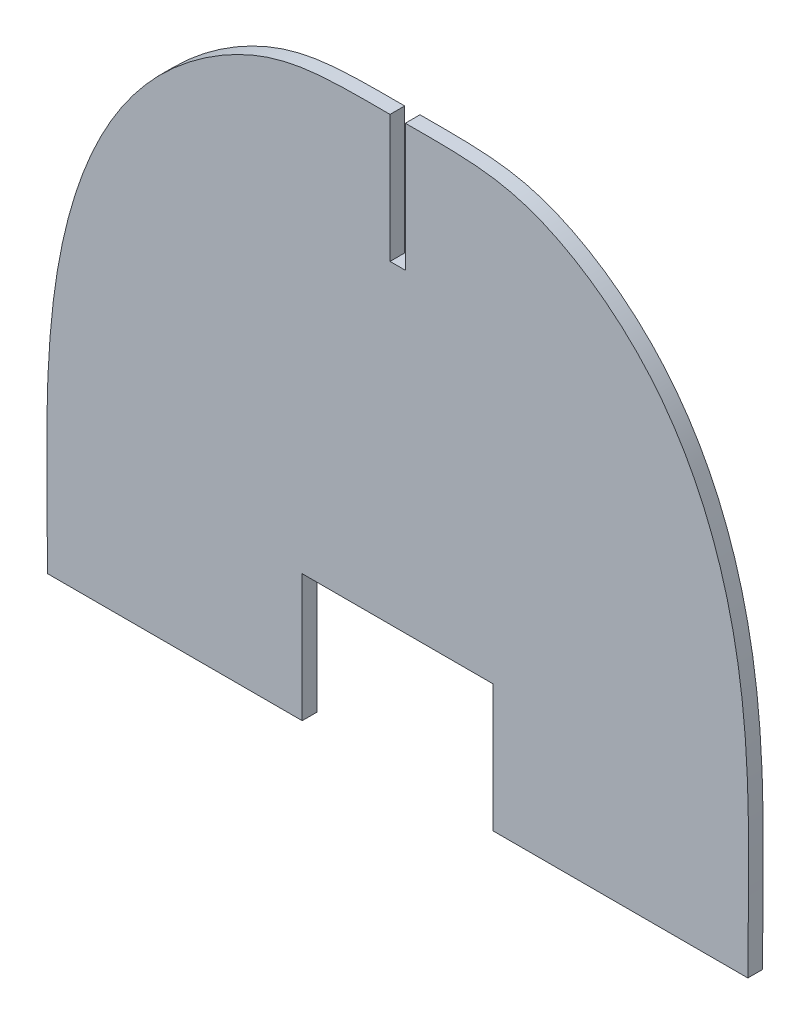
ISO-10303-21;
HEADER;
FILE_DESCRIPTION(('STEP AP214'),'2;1');
FILE_NAME('part.step','',(''),(''),'','','');
FILE_SCHEMA(('AUTOMOTIVE_DESIGN { 1 0 10303 214 1 1 1 1 }'));
ENDSEC;
DATA;
#1=APPLICATION_CONTEXT('core data for automotive mechanical design processes');
#2=APPLICATION_PROTOCOL_DEFINITION('international standard','automotive_design',2000,#1);
#3=PRODUCT_CONTEXT('',#1,'mechanical');
#4=PRODUCT('Part','Part','',(#3));
#5=PRODUCT_RELATED_PRODUCT_CATEGORY('part','',(#4));
#6=PRODUCT_DEFINITION_FORMATION('','',#4);
#7=PRODUCT_DEFINITION_CONTEXT('part definition',#1,'design');
#8=PRODUCT_DEFINITION('design','',#6,#7);
#9=PRODUCT_DEFINITION_SHAPE('','',#8);
#10=(LENGTH_UNIT() NAMED_UNIT(*) SI_UNIT(.MILLI.,.METRE.));
#11=(NAMED_UNIT(*) PLANE_ANGLE_UNIT() SI_UNIT($,.RADIAN.));
#12=(NAMED_UNIT(*) SI_UNIT($,.STERADIAN.) SOLID_ANGLE_UNIT());
#13=UNCERTAINTY_MEASURE_WITH_UNIT(LENGTH_MEASURE(1.E-05),#10,'distance_accuracy_value','');
#14=(GEOMETRIC_REPRESENTATION_CONTEXT(3) GLOBAL_UNCERTAINTY_ASSIGNED_CONTEXT((#13)) GLOBAL_UNIT_ASSIGNED_CONTEXT((#10,
#11,#12)) REPRESENTATION_CONTEXT('',''));
#15=CARTESIAN_POINT('',(0.,0.,0.));
#16=DIRECTION('',(0.,0.,1.));
#17=DIRECTION('',(1.,0.,0.));
#18=AXIS2_PLACEMENT_3D('',#15,#16,#17);
#19=CARTESIAN_POINT('',(139.7,39.6875,5.842));
#20=CARTESIAN_POINT('',(139.7,75.2222726862967,5.842));
#21=CARTESIAN_POINT('',(143.597858606018,144.621704947406,5.842));
#22=CARTESIAN_POINT('',(111.185848272147,228.593704444795,5.842));
#23=CARTESIAN_POINT('',(50.2467887246374,267.616547830515,5.842));
#24=CARTESIAN_POINT('',(21.2133261516497,266.7,5.842));
#25=CARTESIAN_POINT('',(0.,266.7,5.842));
#26=B_SPLINE_CURVE_WITH_KNOTS('',3,(#19,#20,#21,#22,#23,#24,#25),.UNSPECIFIED.,.F.,.F.,(4,1,1,1,
4),(0.,0.354072184251749,0.666318588897678,0.83463285670449,1.),.UNSPECIFIED.);
#27=DIRECTION('',(0.,0.,-1.));
#28=VECTOR('',#27,1.);
#29=SURFACE_OF_LINEAR_EXTRUSION('',#26,#28);
#30=CARTESIAN_POINT('',(139.7,39.6875,0.));
#31=CARTESIAN_POINT('',(139.7,75.2222726862967,0.));
#32=CARTESIAN_POINT('',(143.597858606018,144.621704947406,0.));
#33=CARTESIAN_POINT('',(111.185848272147,228.593704444795,0.));
#34=CARTESIAN_POINT('',(50.2467887246374,267.616547830515,0.));
#35=CARTESIAN_POINT('',(21.2133261516497,266.7,0.));
#36=CARTESIAN_POINT('',(0.,266.7,0.));
#37=B_SPLINE_CURVE_WITH_KNOTS('',3,(#30,#31,#32,#33,#34,#35,#36),.UNSPECIFIED.,.F.,.F.,(4,1,1,1,
4),(0.,0.354072184251749,0.666318588897678,0.83463285670449,1.),.UNSPECIFIED.);
#38=CARTESIAN_POINT('',(139.7,39.6875,0.));
#39=VERTEX_POINT('',#38);
#40=CARTESIAN_POINT('',(3.048,266.702576177167,0.));
#41=VERTEX_POINT('',#40);
#42=EDGE_CURVE('E210',#39,#41,#37,.T.);
#43=ORIENTED_EDGE('',*,*,#42,.T.);
#44=DIRECTION('',(0.,0.,-1.));
#45=VECTOR('',#44,1.);
#46=CARTESIAN_POINT('',(3.04800000000003,266.702576177159,5.842));
#47=LINE('',#46,#45);
#48=CARTESIAN_POINT('',(3.048,266.702576177167,5.842));
#49=VERTEX_POINT('',#48);
#50=EDGE_CURVE('E223',#41,#49,#47,.F.);
#51=ORIENTED_EDGE('',*,*,#50,.T.);
#52=CARTESIAN_POINT('',(139.7,39.6875,5.842));
#53=VERTEX_POINT('',#52);
#54=EDGE_CURVE('E202',#53,#49,#26,.T.);
#55=ORIENTED_EDGE('',*,*,#54,.F.);
#56=DIRECTION('',(0.,0.,-1.));
#57=VECTOR('',#56,1.);
#58=CARTESIAN_POINT('',(139.7,39.6875,5.842));
#59=LINE('',#58,#57);
#60=EDGE_CURVE('E11',#53,#39,#59,.T.);
#61=ORIENTED_EDGE('',*,*,#60,.T.);
#62=EDGE_LOOP('',(#43,#51,#55,#61));
#63=FACE_BOUND('',#62,.T.);
#64=ADVANCED_FACE('F33',(#63),#29,.F.);
#65=CARTESIAN_POINT('',(139.7,39.6875,5.842));
#66=DIRECTION('',(0.,1.,0.));
#67=DIRECTION('',(-1.,0.,0.));
#68=AXIS2_PLACEMENT_3D('',#65,#66,#67);
#69=PLANE('',#68);
#70=DIRECTION('',(1.,0.,0.));
#71=VECTOR('',#70,1.);
#72=CARTESIAN_POINT('',(139.7,39.6875,5.842));
#73=LINE('',#72,#71);
#74=CARTESIAN_POINT('',(38.1,39.6875,5.842));
#75=VERTEX_POINT('',#74);
#76=EDGE_CURVE('E41',#75,#53,#73,.T.);
#77=ORIENTED_EDGE('',*,*,#76,.F.);
#78=DIRECTION('',(0.,0.,1.));
#79=VECTOR('',#78,1.);
#80=CARTESIAN_POINT('',(38.1,39.6875,0.));
#81=LINE('',#80,#79);
#82=CARTESIAN_POINT('',(38.1,39.6875,0.));
#83=VERTEX_POINT('',#82);
#84=EDGE_CURVE('E198',#83,#75,#81,.T.);
#85=ORIENTED_EDGE('',*,*,#84,.F.);
#86=DIRECTION('',(1.,0.,0.));
#87=VECTOR('',#86,1.);
#88=CARTESIAN_POINT('',(139.7,39.6875,0.));
#89=LINE('',#88,#87);
#90=EDGE_CURVE('E204',#83,#39,#89,.T.);
#91=ORIENTED_EDGE('',*,*,#90,.T.);
#92=ORIENTED_EDGE('',*,*,#60,.F.);
#93=EDGE_LOOP('',(#77,#85,#91,#92));
#94=FACE_BOUND('',#93,.T.);
#95=ADVANCED_FACE('F186',(#94),#69,.F.);
#96=CARTESIAN_POINT('',(122.835130798649,191.964149734916,5.842));
#97=DIRECTION('',(0.,0.,-1.));
#98=DIRECTION('',(-1.,0.,0.));
#99=AXIS2_PLACEMENT_3D('',#96,#97,#98);
#100=PLANE('',#99);
#101=ORIENTED_EDGE('',*,*,#54,.T.);
#102=DIRECTION('',(0.,1.,0.));
#103=VECTOR('',#102,1.);
#104=CARTESIAN_POINT('',(3.048,268.866877319355,5.842));
#105=LINE('',#104,#103);
#106=CARTESIAN_POINT('',(3.04800000000001,215.9,5.842));
#107=VERTEX_POINT('',#106);
#108=EDGE_CURVE('E118',#107,#49,#105,.T.);
#109=ORIENTED_EDGE('',*,*,#108,.F.);
#110=DIRECTION('',(1.,0.,0.));
#111=VECTOR('',#110,1.);
#112=CARTESIAN_POINT('',(0.,215.9,5.842));
#113=LINE('',#112,#111);
#114=CARTESIAN_POINT('',(-3.04800000000001,215.9,5.842));
#115=VERTEX_POINT('',#114);
#116=EDGE_CURVE('E110',#115,#107,#113,.T.);
#117=ORIENTED_EDGE('',*,*,#116,.F.);
#118=DIRECTION('',(0.,1.,0.));
#119=VECTOR('',#118,1.);
#120=CARTESIAN_POINT('',(-3.048,268.866877319355,5.842));
#121=LINE('',#120,#119);
#122=CARTESIAN_POINT('',(-3.048,266.702576177167,5.842));
#123=VERTEX_POINT('',#122);
#124=EDGE_CURVE('E116',#115,#123,#121,.T.);
#125=ORIENTED_EDGE('',*,*,#124,.T.);
#126=CARTESIAN_POINT('',(-139.7,39.6875,5.842));
#127=CARTESIAN_POINT('',(-139.7,75.2222726862967,5.842));
#128=CARTESIAN_POINT('',(-143.597858606018,144.621704947406,5.842));
#129=CARTESIAN_POINT('',(-111.185848272147,228.593704444795,5.842));
#130=CARTESIAN_POINT('',(-50.2467887246374,267.616547830515,5.842));
#131=CARTESIAN_POINT('',(-21.2133261516497,266.7,5.842));
#132=CARTESIAN_POINT('',(0.,266.7,5.842));
#133=B_SPLINE_CURVE_WITH_KNOTS('',3,(#126,#127,#128,#129,#130,#131,#132),.UNSPECIFIED.,.F.,.F.,
(4,1,1,1,4),(0.,0.354072184251749,0.666318588897678,0.83463285670449,1.),.UNSPECIFIED.);
#134=CARTESIAN_POINT('',(-139.7,39.6875,5.842));
#135=VERTEX_POINT('',#134);
#136=EDGE_CURVE('E152',#135,#123,#133,.T.);
#137=ORIENTED_EDGE('',*,*,#136,.F.);
#138=DIRECTION('',(-1.,0.,0.));
#139=VECTOR('',#138,1.);
#140=CARTESIAN_POINT('',(-139.7,39.6875,5.842));
#141=LINE('',#140,#139);
#142=CARTESIAN_POINT('',(-38.1,39.6875,5.842));
#143=VERTEX_POINT('',#142);
#144=EDGE_CURVE('E157',#143,#135,#141,.T.);
#145=ORIENTED_EDGE('',*,*,#144,.F.);
#146=DIRECTION('',(0.,1.,0.));
#147=VECTOR('',#146,1.);
#148=CARTESIAN_POINT('',(-38.1,39.6875,5.842));
#149=LINE('',#148,#147);
#150=CARTESIAN_POINT('',(-38.1,90.4875,5.842));
#151=VERTEX_POINT('',#150);
#152=EDGE_CURVE('E139',#143,#151,#149,.T.);
#153=ORIENTED_EDGE('',*,*,#152,.T.);
#154=DIRECTION('',(-1.,0.,0.));
#155=VECTOR('',#154,1.);
#156=CARTESIAN_POINT('',(0.,90.4875,5.842));
#157=LINE('',#156,#155);
#158=CARTESIAN_POINT('',(38.1,90.4875,5.842));
#159=VERTEX_POINT('',#158);
#160=EDGE_CURVE('E233',#159,#151,#157,.T.);
#161=ORIENTED_EDGE('',*,*,#160,.F.);
#162=DIRECTION('',(0.,1.,0.));
#163=VECTOR('',#162,1.);
#164=CARTESIAN_POINT('',(38.1,39.6875,5.842));
#165=LINE('',#164,#163);
#166=EDGE_CURVE('E230',#75,#159,#165,.T.);
#167=ORIENTED_EDGE('',*,*,#166,.F.);
#168=ORIENTED_EDGE('',*,*,#76,.T.);
#169=EDGE_LOOP('',(#101,#109,#117,#125,#137,#145,#153,#161,#167,#168));
#170=FACE_BOUND('',#169,.T.);
#171=ADVANCED_FACE('F113',(#170),#100,.F.);
#172=CARTESIAN_POINT('',(122.835130798649,191.964149734916,0.));
#173=DIRECTION('',(0.,0.,-1.));
#174=DIRECTION('',(-1.,0.,0.));
#175=AXIS2_PLACEMENT_3D('',#172,#173,#174);
#176=PLANE('',#175);
#177=DIRECTION('',(0.,1.,0.));
#178=VECTOR('',#177,1.);
#179=CARTESIAN_POINT('',(3.048,268.866877319355,0.));
#180=LINE('',#179,#178);
#181=CARTESIAN_POINT('',(3.04800000000001,215.9,0.));
#182=VERTEX_POINT('',#181);
#183=EDGE_CURVE('E48',#182,#41,#180,.T.);
#184=ORIENTED_EDGE('',*,*,#183,.T.);
#185=ORIENTED_EDGE('',*,*,#42,.F.);
#186=ORIENTED_EDGE('',*,*,#90,.F.);
#187=DIRECTION('',(0.,1.,0.));
#188=VECTOR('',#187,1.);
#189=CARTESIAN_POINT('',(38.1,39.6875,0.));
#190=LINE('',#189,#188);
#191=CARTESIAN_POINT('',(38.1,90.4875,0.));
#192=VERTEX_POINT('',#191);
#193=EDGE_CURVE('E231',#83,#192,#190,.T.);
#194=ORIENTED_EDGE('',*,*,#193,.T.);
#195=DIRECTION('',(-1.,0.,0.));
#196=VECTOR('',#195,1.);
#197=CARTESIAN_POINT('',(0.,90.4875,0.));
#198=LINE('',#197,#196);
#199=CARTESIAN_POINT('',(-38.1,90.4875,0.));
#200=VERTEX_POINT('',#199);
#201=EDGE_CURVE('E56',#192,#200,#198,.T.);
#202=ORIENTED_EDGE('',*,*,#201,.T.);
#203=DIRECTION('',(0.,1.,0.));
#204=VECTOR('',#203,1.);
#205=CARTESIAN_POINT('',(-38.1,39.6875,0.));
#206=LINE('',#205,#204);
#207=CARTESIAN_POINT('',(-38.1,39.6875,0.));
#208=VERTEX_POINT('',#207);
#209=EDGE_CURVE('E140',#208,#200,#206,.T.);
#210=ORIENTED_EDGE('',*,*,#209,.F.);
#211=DIRECTION('',(-1.,0.,0.));
#212=VECTOR('',#211,1.);
#213=CARTESIAN_POINT('',(-139.7,39.6875,0.));
#214=LINE('',#213,#212);
#215=CARTESIAN_POINT('',(-139.7,39.6875,0.));
#216=VERTEX_POINT('',#215);
#217=EDGE_CURVE('E158',#208,#216,#214,.T.);
#218=ORIENTED_EDGE('',*,*,#217,.T.);
#219=CARTESIAN_POINT('',(-139.7,39.6875,0.));
#220=CARTESIAN_POINT('',(-139.7,75.2222726862967,0.));
#221=CARTESIAN_POINT('',(-143.597858606018,144.621704947406,0.));
#222=CARTESIAN_POINT('',(-111.185848272147,228.593704444795,0.));
#223=CARTESIAN_POINT('',(-50.2467887246374,267.616547830515,0.));
#224=CARTESIAN_POINT('',(-21.2133261516497,266.7,0.));
#225=CARTESIAN_POINT('',(0.,266.7,0.));
#226=B_SPLINE_CURVE_WITH_KNOTS('',3,(#219,#220,#221,#222,#223,#224,#225),.UNSPECIFIED.,.F.,.F.,
(4,1,1,1,4),(0.,0.354072184251749,0.666318588897678,0.83463285670449,1.),.UNSPECIFIED.);
#227=CARTESIAN_POINT('',(-3.048,266.702576177167,0.));
#228=VERTEX_POINT('',#227);
#229=EDGE_CURVE('E149',#216,#228,#226,.T.);
#230=ORIENTED_EDGE('',*,*,#229,.T.);
#231=DIRECTION('',(0.,1.,0.));
#232=VECTOR('',#231,1.);
#233=CARTESIAN_POINT('',(-3.048,268.866877319355,0.));
#234=LINE('',#233,#232);
#235=CARTESIAN_POINT('',(-3.04800000000001,215.9,0.));
#236=VERTEX_POINT('',#235);
#237=EDGE_CURVE('E130',#236,#228,#234,.T.);
#238=ORIENTED_EDGE('',*,*,#237,.F.);
#239=DIRECTION('',(1.,0.,0.));
#240=VECTOR('',#239,1.);
#241=CARTESIAN_POINT('',(0.,215.9,0.));
#242=LINE('',#241,#240);
#243=EDGE_CURVE('E126',#236,#182,#242,.T.);
#244=ORIENTED_EDGE('',*,*,#243,.T.);
#245=EDGE_LOOP('',(#184,#185,#186,#194,#202,#210,#218,#230,#238,#244));
#246=FACE_BOUND('',#245,.T.);
#247=ADVANCED_FACE('F180',(#246),#176,.T.);
#248=CARTESIAN_POINT('',(0.,90.4875,0.));
#249=DIRECTION('',(0.,1.,0.));
#250=DIRECTION('',(0.,0.,1.));
#251=AXIS2_PLACEMENT_3D('',#248,#249,#250);
#252=PLANE('',#251);
#253=ORIENTED_EDGE('',*,*,#160,.T.);
#254=DIRECTION('',(0.,0.,1.));
#255=VECTOR('',#254,1.);
#256=CARTESIAN_POINT('',(-38.1,90.4875,0.));
#257=LINE('',#256,#255);
#258=EDGE_CURVE('E146',#200,#151,#257,.T.);
#259=ORIENTED_EDGE('',*,*,#258,.F.);
#260=ORIENTED_EDGE('',*,*,#201,.F.);
#261=DIRECTION('',(0.,0.,1.));
#262=VECTOR('',#261,1.);
#263=CARTESIAN_POINT('',(38.1,90.4875,0.));
#264=LINE('',#263,#262);
#265=EDGE_CURVE('E214',#192,#159,#264,.T.);
#266=ORIENTED_EDGE('',*,*,#265,.T.);
#267=EDGE_LOOP('',(#253,#259,#260,#266));
#268=FACE_BOUND('',#267,.T.);
#269=ADVANCED_FACE('F177',(#268),#252,.F.);
#270=CARTESIAN_POINT('',(38.1,39.6875,0.));
#271=DIRECTION('',(1.,0.,0.));
#272=DIRECTION('',(0.,0.,-1.));
#273=AXIS2_PLACEMENT_3D('',#270,#271,#272);
#274=PLANE('',#273);
#275=ORIENTED_EDGE('',*,*,#166,.T.);
#276=ORIENTED_EDGE('',*,*,#265,.F.);
#277=ORIENTED_EDGE('',*,*,#193,.F.);
#278=ORIENTED_EDGE('',*,*,#84,.T.);
#279=EDGE_LOOP('',(#275,#276,#277,#278));
#280=FACE_BOUND('',#279,.T.);
#281=ADVANCED_FACE('F174',(#280),#274,.F.);
#282=CARTESIAN_POINT('',(3.048,268.866877319355,0.));
#283=DIRECTION('',(1.,0.,0.));
#284=DIRECTION('',(0.,1.,0.));
#285=AXIS2_PLACEMENT_3D('',#282,#283,#284);
#286=PLANE('',#285);
#287=ORIENTED_EDGE('',*,*,#183,.F.);
#288=DIRECTION('',(0.,0.,1.));
#289=VECTOR('',#288,1.);
#290=CARTESIAN_POINT('',(3.04800000000001,215.9,0.));
#291=LINE('',#290,#289);
#292=EDGE_CURVE('E221',#182,#107,#291,.T.);
#293=ORIENTED_EDGE('',*,*,#292,.T.);
#294=ORIENTED_EDGE('',*,*,#108,.T.);
#295=ORIENTED_EDGE('',*,*,#50,.F.);
#296=EDGE_LOOP('',(#287,#293,#294,#295));
#297=FACE_BOUND('',#296,.T.);
#298=ADVANCED_FACE('F171',(#297),#286,.F.);
#299=CARTESIAN_POINT('',(0.,215.9,0.));
#300=DIRECTION('',(0.,-1.,0.));
#301=DIRECTION('',(0.,0.,-1.));
#302=AXIS2_PLACEMENT_3D('',#299,#300,#301);
#303=PLANE('',#302);
#304=ORIENTED_EDGE('',*,*,#116,.T.);
#305=ORIENTED_EDGE('',*,*,#292,.F.);
#306=ORIENTED_EDGE('',*,*,#243,.F.);
#307=DIRECTION('',(0.,0.,1.));
#308=VECTOR('',#307,1.);
#309=CARTESIAN_POINT('',(-3.04800000000001,215.9,0.));
#310=LINE('',#309,#308);
#311=EDGE_CURVE('E123',#236,#115,#310,.T.);
#312=ORIENTED_EDGE('',*,*,#311,.T.);
#313=EDGE_LOOP('',(#304,#305,#306,#312));
#314=FACE_BOUND('',#313,.T.);
#315=ADVANCED_FACE('F124',(#314),#303,.F.);
#316=DIRECTION('',(0.,0.,-1.));
#317=VECTOR('',#316,1.);
#318=SURFACE_OF_LINEAR_EXTRUSION('',#133,#317);
#319=ORIENTED_EDGE('',*,*,#229,.F.);
#320=DIRECTION('',(0.,0.,-1.));
#321=VECTOR('',#320,1.);
#322=CARTESIAN_POINT('',(-139.7,39.6875,5.842));
#323=LINE('',#322,#321);
#324=EDGE_CURVE('E120',#135,#216,#323,.T.);
#325=ORIENTED_EDGE('',*,*,#324,.F.);
#326=ORIENTED_EDGE('',*,*,#136,.T.);
#327=DIRECTION('',(0.,0.,-1.));
#328=VECTOR('',#327,1.);
#329=CARTESIAN_POINT('',(-3.04800000000003,266.702576177159,5.842));
#330=LINE('',#329,#328);
#331=EDGE_CURVE('E129',#228,#123,#330,.F.);
#332=ORIENTED_EDGE('',*,*,#331,.F.);
#333=EDGE_LOOP('',(#319,#325,#326,#332));
#334=FACE_BOUND('',#333,.T.);
#335=ADVANCED_FACE('F164',(#334),#318,.T.);
#336=CARTESIAN_POINT('',(-139.7,39.6875,5.842));
#337=DIRECTION('',(0.,1.,0.));
#338=DIRECTION('',(1.,0.,0.));
#339=AXIS2_PLACEMENT_3D('',#336,#337,#338);
#340=PLANE('',#339);
#341=ORIENTED_EDGE('',*,*,#144,.T.);
#342=ORIENTED_EDGE('',*,*,#324,.T.);
#343=ORIENTED_EDGE('',*,*,#217,.F.);
#344=DIRECTION('',(0.,0.,1.));
#345=VECTOR('',#344,1.);
#346=CARTESIAN_POINT('',(-38.1,39.6875,0.));
#347=LINE('',#346,#345);
#348=EDGE_CURVE('E143',#208,#143,#347,.T.);
#349=ORIENTED_EDGE('',*,*,#348,.T.);
#350=EDGE_LOOP('',(#341,#342,#343,#349));
#351=FACE_BOUND('',#350,.T.);
#352=ADVANCED_FACE('F168',(#351),#340,.F.);
#353=CARTESIAN_POINT('',(-38.1,39.6875,0.));
#354=DIRECTION('',(-1.,0.,0.));
#355=DIRECTION('',(0.,0.,-1.));
#356=AXIS2_PLACEMENT_3D('',#353,#354,#355);
#357=PLANE('',#356);
#358=ORIENTED_EDGE('',*,*,#152,.F.);
#359=ORIENTED_EDGE('',*,*,#348,.F.);
#360=ORIENTED_EDGE('',*,*,#209,.T.);
#361=ORIENTED_EDGE('',*,*,#258,.T.);
#362=EDGE_LOOP('',(#358,#359,#360,#361));
#363=FACE_BOUND('',#362,.T.);
#364=ADVANCED_FACE('F241',(#363),#357,.F.);
#365=CARTESIAN_POINT('',(-3.048,268.866877319355,0.));
#366=DIRECTION('',(-1.,0.,0.));
#367=DIRECTION('',(0.,1.,0.));
#368=AXIS2_PLACEMENT_3D('',#365,#366,#367);
#369=PLANE('',#368);
#370=ORIENTED_EDGE('',*,*,#237,.T.);
#371=ORIENTED_EDGE('',*,*,#331,.T.);
#372=ORIENTED_EDGE('',*,*,#124,.F.);
#373=ORIENTED_EDGE('',*,*,#311,.F.);
#374=EDGE_LOOP('',(#370,#371,#372,#373));
#375=FACE_BOUND('',#374,.T.);
#376=ADVANCED_FACE('F132',(#375),#369,.F.);
#377=CLOSED_SHELL('',(#64,#95,#171,#247,#269,#281,#298,#315,#335,#352,#364,#376));
#378=MANIFOLD_SOLID_BREP('B2',#377);
#379=ADVANCED_BREP_SHAPE_REPRESENTATION('',(#18,#378),#14);
#380=SHAPE_DEFINITION_REPRESENTATION(#9,#379);
ENDSEC;
END-ISO-10303-21;
